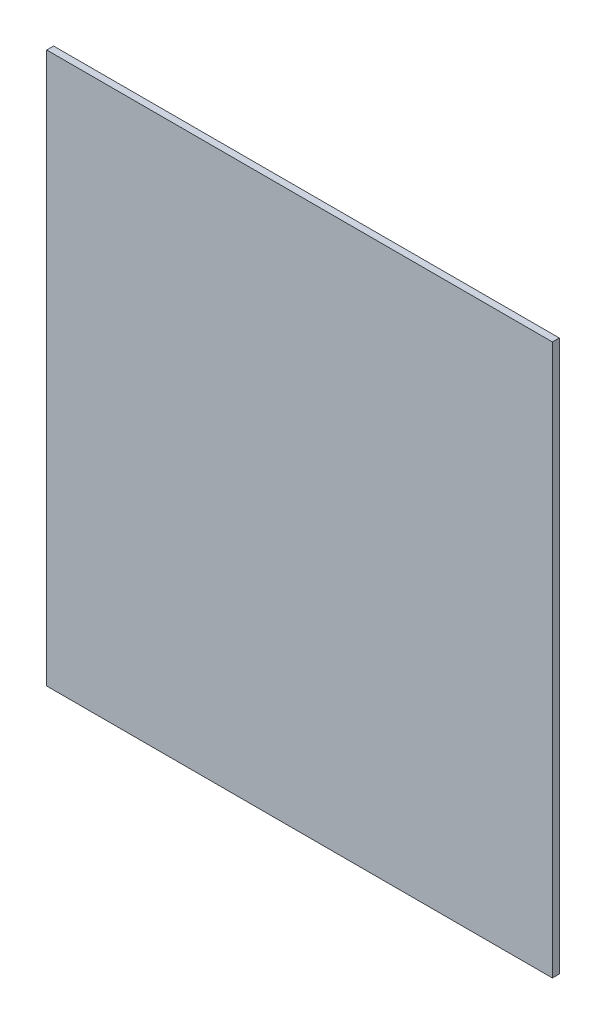
ISO-10303-21;
HEADER;
FILE_DESCRIPTION(('STEP AP214'),'2;1');
FILE_NAME('part.step','',(''),(''),'','','');
FILE_SCHEMA(('AUTOMOTIVE_DESIGN { 1 0 10303 214 1 1 1 1 }'));
ENDSEC;
DATA;
#1=APPLICATION_CONTEXT('core data for automotive mechanical design processes');
#2=APPLICATION_PROTOCOL_DEFINITION('international standard','automotive_design',2000,#1);
#3=PRODUCT_CONTEXT('',#1,'mechanical');
#4=PRODUCT('Part','Part','',(#3));
#5=PRODUCT_RELATED_PRODUCT_CATEGORY('part','',(#4));
#6=PRODUCT_DEFINITION_FORMATION('','',#4);
#7=PRODUCT_DEFINITION_CONTEXT('part definition',#1,'design');
#8=PRODUCT_DEFINITION('design','',#6,#7);
#9=PRODUCT_DEFINITION_SHAPE('','',#8);
#10=(LENGTH_UNIT() NAMED_UNIT(*) SI_UNIT(.MILLI.,.METRE.));
#11=(NAMED_UNIT(*) PLANE_ANGLE_UNIT() SI_UNIT($,.RADIAN.));
#12=(NAMED_UNIT(*) SI_UNIT($,.STERADIAN.) SOLID_ANGLE_UNIT());
#13=UNCERTAINTY_MEASURE_WITH_UNIT(LENGTH_MEASURE(1.E-05),#10,'distance_accuracy_value','');
#14=(GEOMETRIC_REPRESENTATION_CONTEXT(3) GLOBAL_UNCERTAINTY_ASSIGNED_CONTEXT((#13)) GLOBAL_UNIT_ASSIGNED_CONTEXT((#10,
#11,#12)) REPRESENTATION_CONTEXT('',''));
#15=CARTESIAN_POINT('',(0.,0.,0.));
#16=DIRECTION('',(0.,0.,1.));
#17=DIRECTION('',(1.,0.,0.));
#18=AXIS2_PLACEMENT_3D('',#15,#16,#17);
#19=CARTESIAN_POINT('',(0.,0.,0.08382));
#20=DIRECTION('',(0.,0.,1.));
#21=DIRECTION('',(1.,0.,0.));
#22=AXIS2_PLACEMENT_3D('',#19,#20,#21);
#23=PLANE('',#22);
#24=DIRECTION('',(0.,1.,0.));
#25=VECTOR('',#24,1.);
#26=CARTESIAN_POINT('',(-0.705,0.305,0.08382));
#27=LINE('',#26,#25);
#28=CARTESIAN_POINT('',(-0.705,-0.305,0.08382));
#29=VERTEX_POINT('',#28);
#30=CARTESIAN_POINT('',(-0.705,0.305,0.08382));
#31=VERTEX_POINT('',#30);
#32=EDGE_CURVE('E68',#29,#31,#27,.T.);
#33=ORIENTED_EDGE('',*,*,#32,.F.);
#34=DIRECTION('',(1.,0.,0.));
#35=VECTOR('',#34,1.);
#36=CARTESIAN_POINT('',(-0.705,-0.305,0.08382));
#37=LINE('',#36,#35);
#38=CARTESIAN_POINT('',(-0.145,-0.305,0.08382));
#39=VERTEX_POINT('',#38);
#40=EDGE_CURVE('E20',#39,#29,#37,.F.);
#41=ORIENTED_EDGE('',*,*,#40,.F.);
#42=DIRECTION('',(0.,1.,0.));
#43=VECTOR('',#42,1.);
#44=CARTESIAN_POINT('',(-0.145,-0.305,0.08382));
#45=LINE('',#44,#43);
#46=CARTESIAN_POINT('',(-0.145,0.305,0.08382));
#47=VERTEX_POINT('',#46);
#48=EDGE_CURVE('E58',#47,#39,#45,.F.);
#49=ORIENTED_EDGE('',*,*,#48,.F.);
#50=DIRECTION('',(1.,0.,0.));
#51=VECTOR('',#50,1.);
#52=CARTESIAN_POINT('',(-0.145,0.305,0.08382));
#53=LINE('',#52,#51);
#54=EDGE_CURVE('E53',#31,#47,#53,.T.);
#55=ORIENTED_EDGE('',*,*,#54,.F.);
#56=EDGE_LOOP('',(#33,#41,#49,#55));
#57=FACE_BOUND('',#56,.T.);
#58=ADVANCED_FACE('F17',(#57),#23,.T.);
#59=CARTESIAN_POINT('',(-0.705,-0.305,0.0762));
#60=DIRECTION('',(0.,-1.,0.));
#61=DIRECTION('',(0.,0.,-1.));
#62=AXIS2_PLACEMENT_3D('',#59,#60,#61);
#63=PLANE('',#62);
#64=DIRECTION('',(0.,0.,1.));
#65=VECTOR('',#64,1.);
#66=CARTESIAN_POINT('',(-0.705,-0.305,0.0762));
#67=LINE('',#66,#65);
#68=CARTESIAN_POINT('',(-0.705,-0.305,0.0762));
#69=VERTEX_POINT('',#68);
#70=EDGE_CURVE('E79',#69,#29,#67,.T.);
#71=ORIENTED_EDGE('',*,*,#70,.F.);
#72=DIRECTION('',(1.,0.,0.));
#73=VECTOR('',#72,1.);
#74=CARTESIAN_POINT('',(0.,-0.305,0.0762));
#75=LINE('',#74,#73);
#76=CARTESIAN_POINT('',(-0.145,-0.305,0.0762));
#77=VERTEX_POINT('',#76);
#78=EDGE_CURVE('E74',#69,#77,#75,.T.);
#79=ORIENTED_EDGE('',*,*,#78,.T.);
#80=DIRECTION('',(0.,0.,-1.));
#81=VECTOR('',#80,1.);
#82=CARTESIAN_POINT('',(-0.145,-0.305,0.0762));
#83=LINE('',#82,#81);
#84=EDGE_CURVE('E63',#39,#77,#83,.T.);
#85=ORIENTED_EDGE('',*,*,#84,.F.);
#86=ORIENTED_EDGE('',*,*,#40,.T.);
#87=EDGE_LOOP('',(#71,#79,#85,#86));
#88=FACE_BOUND('',#87,.T.);
#89=ADVANCED_FACE('F73',(#88),#63,.T.);
#90=CARTESIAN_POINT('',(-0.145,-0.305,0.0762));
#91=DIRECTION('',(1.,0.,0.));
#92=DIRECTION('',(0.,0.,-1.));
#93=AXIS2_PLACEMENT_3D('',#90,#91,#92);
#94=PLANE('',#93);
#95=ORIENTED_EDGE('',*,*,#84,.T.);
#96=DIRECTION('',(0.,1.,0.));
#97=VECTOR('',#96,1.);
#98=CARTESIAN_POINT('',(-0.145,0.,0.0762));
#99=LINE('',#98,#97);
#100=CARTESIAN_POINT('',(-0.145,0.305,0.0762));
#101=VERTEX_POINT('',#100);
#102=EDGE_CURVE('E84',#77,#101,#99,.T.);
#103=ORIENTED_EDGE('',*,*,#102,.T.);
#104=DIRECTION('',(0.,0.,1.));
#105=VECTOR('',#104,1.);
#106=CARTESIAN_POINT('',(-0.145,0.305,0.0762));
#107=LINE('',#106,#105);
#108=EDGE_CURVE('E65',#47,#101,#107,.F.);
#109=ORIENTED_EDGE('',*,*,#108,.F.);
#110=ORIENTED_EDGE('',*,*,#48,.T.);
#111=EDGE_LOOP('',(#95,#103,#109,#110));
#112=FACE_BOUND('',#111,.T.);
#113=ADVANCED_FACE('F60',(#112),#94,.T.);
#114=CARTESIAN_POINT('',(-0.145,0.305,0.0762));
#115=DIRECTION('',(0.,1.,0.));
#116=DIRECTION('',(0.,0.,1.));
#117=AXIS2_PLACEMENT_3D('',#114,#115,#116);
#118=PLANE('',#117);
#119=ORIENTED_EDGE('',*,*,#108,.T.);
#120=DIRECTION('',(1.,0.,0.));
#121=VECTOR('',#120,1.);
#122=CARTESIAN_POINT('',(0.,0.305,0.0762));
#123=LINE('',#122,#121);
#124=CARTESIAN_POINT('',(-0.705,0.305,0.0762));
#125=VERTEX_POINT('',#124);
#126=EDGE_CURVE('E26',#101,#125,#123,.F.);
#127=ORIENTED_EDGE('',*,*,#126,.T.);
#128=DIRECTION('',(0.,0.,1.));
#129=VECTOR('',#128,1.);
#130=CARTESIAN_POINT('',(-0.705,0.305,0.0762));
#131=LINE('',#130,#129);
#132=EDGE_CURVE('E34',#31,#125,#131,.F.);
#133=ORIENTED_EDGE('',*,*,#132,.F.);
#134=ORIENTED_EDGE('',*,*,#54,.T.);
#135=EDGE_LOOP('',(#119,#127,#133,#134));
#136=FACE_BOUND('',#135,.T.);
#137=ADVANCED_FACE('F88',(#136),#118,.T.);
#138=CARTESIAN_POINT('',(-0.705,0.305,0.0762));
#139=DIRECTION('',(-1.,0.,0.));
#140=DIRECTION('',(0.,0.,1.));
#141=AXIS2_PLACEMENT_3D('',#138,#139,#140);
#142=PLANE('',#141);
#143=ORIENTED_EDGE('',*,*,#132,.T.);
#144=DIRECTION('',(0.,1.,0.));
#145=VECTOR('',#144,1.);
#146=CARTESIAN_POINT('',(-0.705,0.,0.0762));
#147=LINE('',#146,#145);
#148=EDGE_CURVE('E11',#125,#69,#147,.F.);
#149=ORIENTED_EDGE('',*,*,#148,.T.);
#150=ORIENTED_EDGE('',*,*,#70,.T.);
#151=ORIENTED_EDGE('',*,*,#32,.T.);
#152=EDGE_LOOP('',(#143,#149,#150,#151));
#153=FACE_BOUND('',#152,.T.);
#154=ADVANCED_FACE('F91',(#153),#142,.T.);
#155=CARTESIAN_POINT('',(0.,0.,0.0762));
#156=DIRECTION('',(0.,0.,1.));
#157=DIRECTION('',(1.,0.,0.));
#158=AXIS2_PLACEMENT_3D('',#155,#156,#157);
#159=PLANE('',#158);
#160=ORIENTED_EDGE('',*,*,#126,.F.);
#161=ORIENTED_EDGE('',*,*,#102,.F.);
#162=ORIENTED_EDGE('',*,*,#78,.F.);
#163=ORIENTED_EDGE('',*,*,#148,.F.);
#164=EDGE_LOOP('',(#160,#161,#162,#163));
#165=FACE_BOUND('',#164,.T.);
#166=ADVANCED_FACE('F90',(#165),#159,.F.);
#167=CLOSED_SHELL('',(#58,#89,#113,#137,#154,#166));
#168=MANIFOLD_SOLID_BREP('B1',#167);
#169=ADVANCED_BREP_SHAPE_REPRESENTATION('',(#18,#168),#14);
#170=SHAPE_DEFINITION_REPRESENTATION(#9,#169);
ENDSEC;
END-ISO-10303-21;
